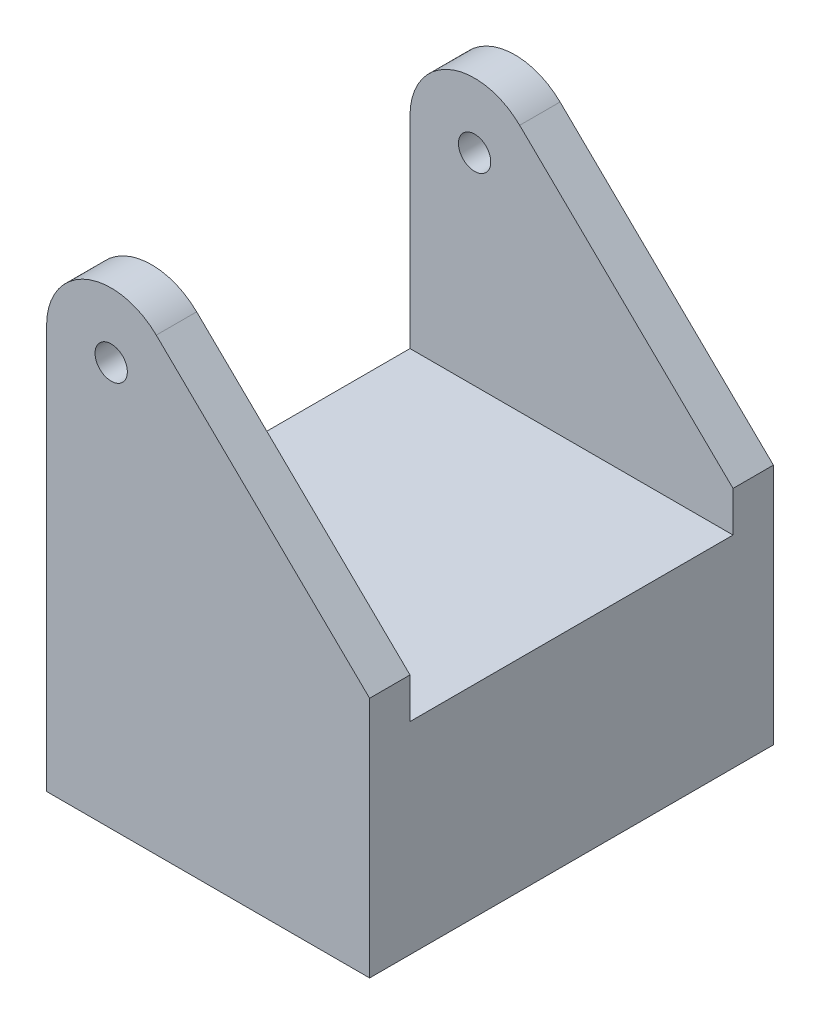
ISO-10303-21;
HEADER;
FILE_DESCRIPTION(('STEP AP214'),'2;1');
FILE_NAME('part.step','',(''),(''),'','','');
FILE_SCHEMA(('AUTOMOTIVE_DESIGN { 1 0 10303 214 1 1 1 1 }'));
ENDSEC;
DATA;
#1=APPLICATION_CONTEXT('core data for automotive mechanical design processes');
#2=APPLICATION_PROTOCOL_DEFINITION('international standard','automotive_design',2000,#1);
#3=PRODUCT_CONTEXT('',#1,'mechanical');
#4=PRODUCT('Part','Part','',(#3));
#5=PRODUCT_RELATED_PRODUCT_CATEGORY('part','',(#4));
#6=PRODUCT_DEFINITION_FORMATION('','',#4);
#7=PRODUCT_DEFINITION_CONTEXT('part definition',#1,'design');
#8=PRODUCT_DEFINITION('design','',#6,#7);
#9=PRODUCT_DEFINITION_SHAPE('','',#8);
#10=(LENGTH_UNIT() NAMED_UNIT(*) SI_UNIT(.MILLI.,.METRE.));
#11=(NAMED_UNIT(*) PLANE_ANGLE_UNIT() SI_UNIT($,.RADIAN.));
#12=(NAMED_UNIT(*) SI_UNIT($,.STERADIAN.) SOLID_ANGLE_UNIT());
#13=UNCERTAINTY_MEASURE_WITH_UNIT(LENGTH_MEASURE(1.E-05),#10,'distance_accuracy_value','');
#14=(GEOMETRIC_REPRESENTATION_CONTEXT(3) GLOBAL_UNCERTAINTY_ASSIGNED_CONTEXT((#13)) GLOBAL_UNIT_ASSIGNED_CONTEXT((#10,
#11,#12)) REPRESENTATION_CONTEXT('',''));
#15=CARTESIAN_POINT('',(0.,0.,0.));
#16=DIRECTION('',(0.,0.,1.));
#17=DIRECTION('',(1.,0.,0.));
#18=AXIS2_PLACEMENT_3D('',#15,#16,#17);
#19=CARTESIAN_POINT('',(172.338605325552,176.941778381358,250.));
#20=DIRECTION('',(-0.697727216701847,-0.716363546722957,0.));
#21=DIRECTION('',(0.716363546722957,-0.697727216701847,0.));
#22=AXIS2_PLACEMENT_3D('',#19,#20,#21);
#23=PLANE('',#22);
#24=DIRECTION('',(0.,0.,-1.));
#25=VECTOR('',#24,1.);
#26=CARTESIAN_POINT('',(67.9090886680738,278.654541868918,250.));
#27=LINE('',#26,#25);
#28=CARTESIAN_POINT('',(67.9090886680738,278.654541868918,25.));
#29=VERTEX_POINT('',#28);
#30=CARTESIAN_POINT('',(67.9090886680738,278.654541868918,0.));
#31=VERTEX_POINT('',#30);
#32=EDGE_CURVE('E144',#29,#31,#27,.T.);
#33=ORIENTED_EDGE('',*,*,#32,.F.);
#34=DIRECTION('',(0.716363546722957,-0.697727216701847,0.));
#35=VECTOR('',#34,1.);
#36=CARTESIAN_POINT('',(172.338605325552,176.941778381358,25.));
#37=LINE('',#36,#35);
#38=CARTESIAN_POINT('',(200.,150.,25.));
#39=VERTEX_POINT('',#38);
#40=EDGE_CURVE('E156',#29,#39,#37,.T.);
#41=ORIENTED_EDGE('',*,*,#40,.T.);
#42=DIRECTION('',(0.,0.,-1.));
#43=VECTOR('',#42,1.);
#44=CARTESIAN_POINT('',(200.,150.,250.));
#45=LINE('',#44,#43);
#46=CARTESIAN_POINT('',(200.,150.,0.));
#47=VERTEX_POINT('',#46);
#48=EDGE_CURVE('E84',#39,#47,#45,.T.);
#49=ORIENTED_EDGE('',*,*,#48,.T.);
#50=DIRECTION('',(-0.716363546722957,0.697727216701847,0.));
#51=VECTOR('',#50,1.);
#52=CARTESIAN_POINT('',(172.338605325552,176.941778381358,0.));
#53=LINE('',#52,#51);
#54=EDGE_CURVE('E127',#47,#31,#53,.T.);
#55=ORIENTED_EDGE('',*,*,#54,.T.);
#56=EDGE_LOOP('',(#33,#41,#49,#55));
#57=FACE_BOUND('',#56,.T.);
#58=ADVANCED_FACE('F35',(#57),#23,.F.);
#59=CARTESIAN_POINT('',(40.,250.,250.));
#60=DIRECTION('',(0.,0.,-1.));
#61=DIRECTION('',(-1.,0.,0.));
#62=AXIS2_PLACEMENT_3D('',#59,#60,#61);
#63=CYLINDRICAL_SURFACE('',#62,40.);
#64=CARTESIAN_POINT('',(40.,250.,25.));
#65=DIRECTION('',(0.,0.,-1.));
#66=DIRECTION('',(0.,1.,0.));
#67=AXIS2_PLACEMENT_3D('',#64,#65,#66);
#68=CIRCLE('',#67,40.);
#69=CARTESIAN_POINT('',(0.,250.,25.));
#70=VERTEX_POINT('',#69);
#71=EDGE_CURVE('E169',#70,#29,#68,.T.);
#72=ORIENTED_EDGE('',*,*,#71,.T.);
#73=ORIENTED_EDGE('',*,*,#32,.T.);
#74=CARTESIAN_POINT('',(40.,250.,0.));
#75=DIRECTION('',(0.,0.,1.));
#76=DIRECTION('',(1.,0.,0.));
#77=AXIS2_PLACEMENT_3D('',#74,#75,#76);
#78=CIRCLE('',#77,40.);
#79=CARTESIAN_POINT('',(0.,250.,0.));
#80=VERTEX_POINT('',#79);
#81=EDGE_CURVE('E129',#31,#80,#78,.T.);
#82=ORIENTED_EDGE('',*,*,#81,.T.);
#83=DIRECTION('',(0.,0.,-1.));
#84=VECTOR('',#83,1.);
#85=CARTESIAN_POINT('',(0.,250.,250.));
#86=LINE('',#85,#84);
#87=EDGE_CURVE('E112',#70,#80,#86,.T.);
#88=ORIENTED_EDGE('',*,*,#87,.F.);
#89=EDGE_LOOP('',(#72,#73,#82,#88));
#90=FACE_BOUND('',#89,.T.);
#91=ADVANCED_FACE('F199',(#90),#63,.T.);
#92=CARTESIAN_POINT('',(40.,250.,264.));
#93=DIRECTION('',(0.,0.,-1.));
#94=DIRECTION('',(-1.,0.,0.));
#95=AXIS2_PLACEMENT_3D('',#92,#93,#94);
#96=CYLINDRICAL_SURFACE('',#95,10.);
#97=CARTESIAN_POINT('',(40.,250.,25.));
#98=DIRECTION('',(0.,0.,-1.));
#99=DIRECTION('',(0.,1.,0.));
#100=AXIS2_PLACEMENT_3D('',#97,#98,#99);
#101=CIRCLE('',#100,10.);
#102=CARTESIAN_POINT('',(40.,260.,25.));
#103=VERTEX_POINT('',#102);
#104=EDGE_CURVE('E149',#103,#103,#101,.F.);
#105=ORIENTED_EDGE('',*,*,#104,.T.);
#106=EDGE_LOOP('',(#105));
#107=FACE_BOUND('',#106,.T.);
#108=CARTESIAN_POINT('',(40.,250.,0.));
#109=DIRECTION('',(0.,0.,-1.));
#110=DIRECTION('',(-1.,0.,0.));
#111=AXIS2_PLACEMENT_3D('',#108,#109,#110);
#112=CIRCLE('',#111,10.);
#113=CARTESIAN_POINT('',(30.,250.,0.));
#114=VERTEX_POINT('',#113);
#115=EDGE_CURVE('E172',#114,#114,#112,.T.);
#116=ORIENTED_EDGE('',*,*,#115,.T.);
#117=EDGE_LOOP('',(#116));
#118=FACE_BOUND('',#117,.T.);
#119=ADVANCED_FACE('F243',(#107,#118),#96,.F.);
#120=CARTESIAN_POINT('',(200.,150.,250.));
#121=VERTEX_POINT('',#120);
#122=CARTESIAN_POINT('',(200.,150.,225.));
#123=VERTEX_POINT('',#122);
#124=EDGE_CURVE('E138',#121,#123,#45,.T.);
#125=ORIENTED_EDGE('',*,*,#124,.T.);
#126=DIRECTION('',(-0.716363546722957,0.697727216701847,0.));
#127=VECTOR('',#126,1.);
#128=CARTESIAN_POINT('',(172.338605325552,176.941778381358,225.));
#129=LINE('',#128,#127);
#130=CARTESIAN_POINT('',(67.9090886680738,278.654541868918,225.));
#131=VERTEX_POINT('',#130);
#132=EDGE_CURVE('E159',#123,#131,#129,.T.);
#133=ORIENTED_EDGE('',*,*,#132,.T.);
#134=CARTESIAN_POINT('',(67.9090886680738,278.654541868918,250.));
#135=VERTEX_POINT('',#134);
#136=EDGE_CURVE('E43',#135,#131,#27,.T.);
#137=ORIENTED_EDGE('',*,*,#136,.F.);
#138=DIRECTION('',(-0.716363546722957,0.697727216701847,0.));
#139=VECTOR('',#138,1.);
#140=CARTESIAN_POINT('',(172.338605325552,176.941778381358,250.));
#141=LINE('',#140,#139);
#142=EDGE_CURVE('E122',#121,#135,#141,.T.);
#143=ORIENTED_EDGE('',*,*,#142,.F.);
#144=EDGE_LOOP('',(#125,#133,#137,#143));
#145=FACE_BOUND('',#144,.T.);
#146=ADVANCED_FACE('F37',(#145),#23,.F.);
#147=CARTESIAN_POINT('',(40.,250.,225.));
#148=DIRECTION('',(0.,0.,1.));
#149=DIRECTION('',(1.,0.,0.));
#150=AXIS2_PLACEMENT_3D('',#147,#148,#149);
#151=CIRCLE('',#150,40.);
#152=CARTESIAN_POINT('',(0.,250.,225.));
#153=VERTEX_POINT('',#152);
#154=EDGE_CURVE('E152',#131,#153,#151,.T.);
#155=ORIENTED_EDGE('',*,*,#154,.T.);
#156=CARTESIAN_POINT('',(0.,250.,250.));
#157=VERTEX_POINT('',#156);
#158=EDGE_CURVE('E142',#157,#153,#86,.T.);
#159=ORIENTED_EDGE('',*,*,#158,.F.);
#160=CARTESIAN_POINT('',(40.,250.,250.));
#161=DIRECTION('',(0.,0.,1.));
#162=DIRECTION('',(1.,0.,0.));
#163=AXIS2_PLACEMENT_3D('',#160,#161,#162);
#164=CIRCLE('',#163,40.);
#165=EDGE_CURVE('E93',#135,#157,#164,.T.);
#166=ORIENTED_EDGE('',*,*,#165,.F.);
#167=ORIENTED_EDGE('',*,*,#136,.T.);
#168=EDGE_LOOP('',(#155,#159,#166,#167));
#169=FACE_BOUND('',#168,.T.);
#170=ADVANCED_FACE('F181',(#169),#63,.T.);
#171=CARTESIAN_POINT('',(0.,0.,250.));
#172=DIRECTION('',(-1.,0.,0.));
#173=DIRECTION('',(0.,0.,1.));
#174=AXIS2_PLACEMENT_3D('',#171,#172,#173);
#175=PLANE('',#174);
#176=DIRECTION('',(0.,-1.,0.));
#177=VECTOR('',#176,1.);
#178=CARTESIAN_POINT('',(0.,290.,25.));
#179=LINE('',#178,#177);
#180=CARTESIAN_POINT('',(0.,125.,25.));
#181=VERTEX_POINT('',#180);
#182=EDGE_CURVE('E220',#70,#181,#179,.T.);
#183=ORIENTED_EDGE('',*,*,#182,.F.);
#184=ORIENTED_EDGE('',*,*,#87,.T.);
#185=DIRECTION('',(0.,1.,0.));
#186=VECTOR('',#185,1.);
#187=CARTESIAN_POINT('',(0.,0.,0.));
#188=LINE('',#187,#186);
#189=CARTESIAN_POINT('',(0.,0.,0.));
#190=VERTEX_POINT('',#189);
#191=EDGE_CURVE('E109',#190,#80,#188,.T.);
#192=ORIENTED_EDGE('',*,*,#191,.F.);
#193=DIRECTION('',(0.,0.,-1.));
#194=VECTOR('',#193,1.);
#195=CARTESIAN_POINT('',(0.,0.,250.));
#196=LINE('',#195,#194);
#197=CARTESIAN_POINT('',(0.,0.,250.));
#198=VERTEX_POINT('',#197);
#199=EDGE_CURVE('E101',#198,#190,#196,.T.);
#200=ORIENTED_EDGE('',*,*,#199,.F.);
#201=DIRECTION('',(0.,1.,0.));
#202=VECTOR('',#201,1.);
#203=CARTESIAN_POINT('',(0.,0.,250.));
#204=LINE('',#203,#202);
#205=EDGE_CURVE('E107',#198,#157,#204,.T.);
#206=ORIENTED_EDGE('',*,*,#205,.T.);
#207=ORIENTED_EDGE('',*,*,#158,.T.);
#208=DIRECTION('',(0.,1.,0.));
#209=VECTOR('',#208,1.);
#210=CARTESIAN_POINT('',(0.,290.,225.));
#211=LINE('',#210,#209);
#212=CARTESIAN_POINT('',(0.,125.,225.));
#213=VERTEX_POINT('',#212);
#214=EDGE_CURVE('E215',#213,#153,#211,.T.);
#215=ORIENTED_EDGE('',*,*,#214,.F.);
#216=DIRECTION('',(0.,0.,1.));
#217=VECTOR('',#216,1.);
#218=CARTESIAN_POINT('',(0.,125.,25.));
#219=LINE('',#218,#217);
#220=EDGE_CURVE('E218',#181,#213,#219,.T.);
#221=ORIENTED_EDGE('',*,*,#220,.F.);
#222=EDGE_LOOP('',(#183,#184,#192,#200,#206,#207,#215,#221));
#223=FACE_BOUND('',#222,.T.);
#224=ADVANCED_FACE('F104',(#223),#175,.T.);
#225=CARTESIAN_POINT('',(0.,0.,250.));
#226=DIRECTION('',(0.,1.,0.));
#227=DIRECTION('',(0.,0.,1.));
#228=AXIS2_PLACEMENT_3D('',#225,#226,#227);
#229=PLANE('',#228);
#230=DIRECTION('',(1.,0.,0.));
#231=VECTOR('',#230,1.);
#232=CARTESIAN_POINT('',(0.,0.,0.));
#233=LINE('',#232,#231);
#234=CARTESIAN_POINT('',(200.,0.,0.));
#235=VERTEX_POINT('',#234);
#236=EDGE_CURVE('E134',#190,#235,#233,.T.);
#237=ORIENTED_EDGE('',*,*,#236,.T.);
#238=DIRECTION('',(0.,0.,-1.));
#239=VECTOR('',#238,1.);
#240=CARTESIAN_POINT('',(200.,0.,250.));
#241=LINE('',#240,#239);
#242=CARTESIAN_POINT('',(200.,0.,250.));
#243=VERTEX_POINT('',#242);
#244=EDGE_CURVE('E113',#243,#235,#241,.T.);
#245=ORIENTED_EDGE('',*,*,#244,.F.);
#246=DIRECTION('',(1.,0.,0.));
#247=VECTOR('',#246,1.);
#248=CARTESIAN_POINT('',(0.,0.,250.));
#249=LINE('',#248,#247);
#250=EDGE_CURVE('E116',#198,#243,#249,.T.);
#251=ORIENTED_EDGE('',*,*,#250,.F.);
#252=ORIENTED_EDGE('',*,*,#199,.T.);
#253=EDGE_LOOP('',(#237,#245,#251,#252));
#254=FACE_BOUND('',#253,.T.);
#255=ADVANCED_FACE('F117',(#254),#229,.F.);
#256=CARTESIAN_POINT('',(200.,0.,250.));
#257=DIRECTION('',(-1.,0.,0.));
#258=DIRECTION('',(0.,0.,1.));
#259=AXIS2_PLACEMENT_3D('',#256,#257,#258);
#260=PLANE('',#259);
#261=ORIENTED_EDGE('',*,*,#48,.F.);
#262=DIRECTION('',(0.,-1.,0.));
#263=VECTOR('',#262,1.);
#264=CARTESIAN_POINT('',(200.,0.,25.));
#265=LINE('',#264,#263);
#266=CARTESIAN_POINT('',(200.,125.,25.));
#267=VERTEX_POINT('',#266);
#268=EDGE_CURVE('E151',#39,#267,#265,.T.);
#269=ORIENTED_EDGE('',*,*,#268,.T.);
#270=DIRECTION('',(0.,0.,1.));
#271=VECTOR('',#270,1.);
#272=CARTESIAN_POINT('',(200.,125.,250.));
#273=LINE('',#272,#271);
#274=CARTESIAN_POINT('',(200.,125.,225.));
#275=VERTEX_POINT('',#274);
#276=EDGE_CURVE('E11',#267,#275,#273,.T.);
#277=ORIENTED_EDGE('',*,*,#276,.T.);
#278=DIRECTION('',(0.,1.,0.));
#279=VECTOR('',#278,1.);
#280=CARTESIAN_POINT('',(200.,0.,225.));
#281=LINE('',#280,#279);
#282=EDGE_CURVE('E148',#275,#123,#281,.T.);
#283=ORIENTED_EDGE('',*,*,#282,.T.);
#284=ORIENTED_EDGE('',*,*,#124,.F.);
#285=DIRECTION('',(0.,1.,0.));
#286=VECTOR('',#285,1.);
#287=CARTESIAN_POINT('',(200.,0.,250.));
#288=LINE('',#287,#286);
#289=EDGE_CURVE('E59',#243,#121,#288,.T.);
#290=ORIENTED_EDGE('',*,*,#289,.F.);
#291=ORIENTED_EDGE('',*,*,#244,.T.);
#292=DIRECTION('',(0.,1.,0.));
#293=VECTOR('',#292,1.);
#294=CARTESIAN_POINT('',(200.,0.,0.));
#295=LINE('',#294,#293);
#296=EDGE_CURVE('E136',#235,#47,#295,.T.);
#297=ORIENTED_EDGE('',*,*,#296,.T.);
#298=EDGE_LOOP('',(#261,#269,#277,#283,#284,#290,#291,#297));
#299=FACE_BOUND('',#298,.T.);
#300=ADVANCED_FACE('F209',(#299),#260,.F.);
#301=CARTESIAN_POINT('',(0.,0.,250.));
#302=DIRECTION('',(0.,0.,1.));
#303=DIRECTION('',(1.,0.,0.));
#304=AXIS2_PLACEMENT_3D('',#301,#302,#303);
#305=PLANE('',#304);
#306=CARTESIAN_POINT('',(40.,250.,250.));
#307=DIRECTION('',(0.,0.,1.));
#308=DIRECTION('',(1.,0.,0.));
#309=AXIS2_PLACEMENT_3D('',#306,#307,#308);
#310=CIRCLE('',#309,10.);
#311=CARTESIAN_POINT('',(50.,250.,250.));
#312=VERTEX_POINT('',#311);
#313=EDGE_CURVE('E130',#312,#312,#310,.T.);
#314=ORIENTED_EDGE('',*,*,#313,.F.);
#315=EDGE_LOOP('',(#314));
#316=FACE_BOUND('',#315,.T.);
#317=ORIENTED_EDGE('',*,*,#142,.T.);
#318=ORIENTED_EDGE('',*,*,#165,.T.);
#319=ORIENTED_EDGE('',*,*,#205,.F.);
#320=ORIENTED_EDGE('',*,*,#250,.T.);
#321=ORIENTED_EDGE('',*,*,#289,.T.);
#322=EDGE_LOOP('',(#317,#318,#319,#320,#321));
#323=FACE_BOUND('',#322,.T.);
#324=ADVANCED_FACE('F120',(#316,#323),#305,.T.);
#325=CARTESIAN_POINT('',(0.,0.,0.));
#326=DIRECTION('',(0.,0.,1.));
#327=DIRECTION('',(1.,0.,0.));
#328=AXIS2_PLACEMENT_3D('',#325,#326,#327);
#329=PLANE('',#328);
#330=ORIENTED_EDGE('',*,*,#115,.F.);
#331=EDGE_LOOP('',(#330));
#332=FACE_BOUND('',#331,.T.);
#333=ORIENTED_EDGE('',*,*,#54,.F.);
#334=ORIENTED_EDGE('',*,*,#296,.F.);
#335=ORIENTED_EDGE('',*,*,#236,.F.);
#336=ORIENTED_EDGE('',*,*,#191,.T.);
#337=ORIENTED_EDGE('',*,*,#81,.F.);
#338=EDGE_LOOP('',(#333,#334,#335,#336,#337));
#339=FACE_BOUND('',#338,.T.);
#340=ADVANCED_FACE('F207',(#332,#339),#329,.F.);
#341=CARTESIAN_POINT('',(40.,250.,225.));
#342=DIRECTION('',(0.,0.,1.));
#343=DIRECTION('',(1.,0.,0.));
#344=AXIS2_PLACEMENT_3D('',#341,#342,#343);
#345=CIRCLE('',#344,10.);
#346=CARTESIAN_POINT('',(50.,250.,225.));
#347=VERTEX_POINT('',#346);
#348=EDGE_CURVE('E146',#347,#347,#345,.F.);
#349=ORIENTED_EDGE('',*,*,#348,.T.);
#350=EDGE_LOOP('',(#349));
#351=FACE_BOUND('',#350,.T.);
#352=ORIENTED_EDGE('',*,*,#313,.T.);
#353=EDGE_LOOP('',(#352));
#354=FACE_BOUND('',#353,.T.);
#355=ADVANCED_FACE('F250',(#351,#354),#96,.F.);
#356=CARTESIAN_POINT('',(264.,125.,25.));
#357=DIRECTION('',(0.,-1.,0.));
#358=DIRECTION('',(0.,0.,-1.));
#359=AXIS2_PLACEMENT_3D('',#356,#357,#358);
#360=PLANE('',#359);
#361=DIRECTION('',(-1.,0.,0.));
#362=VECTOR('',#361,1.);
#363=CARTESIAN_POINT('',(264.,125.,25.));
#364=LINE('',#363,#362);
#365=EDGE_CURVE('E212',#267,#181,#364,.T.);
#366=ORIENTED_EDGE('',*,*,#365,.T.);
#367=ORIENTED_EDGE('',*,*,#220,.T.);
#368=DIRECTION('',(-1.,0.,0.));
#369=VECTOR('',#368,1.);
#370=CARTESIAN_POINT('',(264.,125.,225.));
#371=LINE('',#370,#369);
#372=EDGE_CURVE('E50',#275,#213,#371,.T.);
#373=ORIENTED_EDGE('',*,*,#372,.F.);
#374=ORIENTED_EDGE('',*,*,#276,.F.);
#375=EDGE_LOOP('',(#366,#367,#373,#374));
#376=FACE_BOUND('',#375,.T.);
#377=ADVANCED_FACE('F226',(#376),#360,.F.);
#378=CARTESIAN_POINT('',(264.,290.,25.));
#379=DIRECTION('',(0.,0.,-1.));
#380=DIRECTION('',(0.,1.,0.));
#381=AXIS2_PLACEMENT_3D('',#378,#379,#380);
#382=PLANE('',#381);
#383=ORIENTED_EDGE('',*,*,#104,.F.);
#384=EDGE_LOOP('',(#383));
#385=FACE_BOUND('',#384,.T.);
#386=ORIENTED_EDGE('',*,*,#182,.T.);
#387=ORIENTED_EDGE('',*,*,#365,.F.);
#388=ORIENTED_EDGE('',*,*,#268,.F.);
#389=ORIENTED_EDGE('',*,*,#40,.F.);
#390=ORIENTED_EDGE('',*,*,#71,.F.);
#391=EDGE_LOOP('',(#386,#387,#388,#389,#390));
#392=FACE_BOUND('',#391,.T.);
#393=ADVANCED_FACE('F203',(#385,#392),#382,.F.);
#394=CARTESIAN_POINT('',(264.,290.,225.));
#395=DIRECTION('',(0.,0.,1.));
#396=DIRECTION('',(1.,0.,0.));
#397=AXIS2_PLACEMENT_3D('',#394,#395,#396);
#398=PLANE('',#397);
#399=ORIENTED_EDGE('',*,*,#348,.F.);
#400=EDGE_LOOP('',(#399));
#401=FACE_BOUND('',#400,.T.);
#402=ORIENTED_EDGE('',*,*,#154,.F.);
#403=ORIENTED_EDGE('',*,*,#132,.F.);
#404=ORIENTED_EDGE('',*,*,#282,.F.);
#405=ORIENTED_EDGE('',*,*,#372,.T.);
#406=ORIENTED_EDGE('',*,*,#214,.T.);
#407=EDGE_LOOP('',(#402,#403,#404,#405,#406));
#408=FACE_BOUND('',#407,.T.);
#409=ADVANCED_FACE('F228',(#401,#408),#398,.F.);
#410=CLOSED_SHELL('',(#58,#91,#119,#146,#170,#224,#255,#300,#324,#340,#355,#377,#393,#409));
#411=MANIFOLD_SOLID_BREP('B2',#410);
#412=ADVANCED_BREP_SHAPE_REPRESENTATION('',(#18,#411),#14);
#413=SHAPE_DEFINITION_REPRESENTATION(#9,#412);
ENDSEC;
END-ISO-10303-21;
